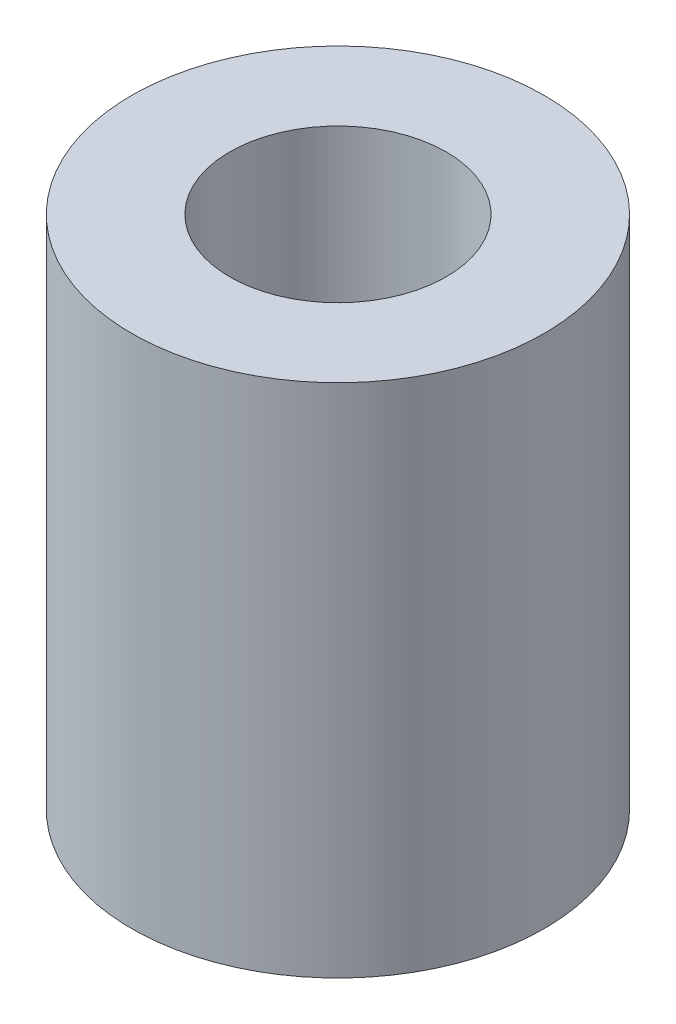
ISO-10303-21;
HEADER;
FILE_DESCRIPTION(('STEP AP214'),'2;1');
FILE_NAME('part.step','',(''),(''),'','','');
FILE_SCHEMA(('AUTOMOTIVE_DESIGN { 1 0 10303 214 1 1 1 1 }'));
ENDSEC;
DATA;
#1=APPLICATION_CONTEXT('core data for automotive mechanical design processes');
#2=APPLICATION_PROTOCOL_DEFINITION('international standard','automotive_design',2000,#1);
#3=PRODUCT_CONTEXT('',#1,'mechanical');
#4=PRODUCT('Part','Part','',(#3));
#5=PRODUCT_RELATED_PRODUCT_CATEGORY('part','',(#4));
#6=PRODUCT_DEFINITION_FORMATION('','',#4);
#7=PRODUCT_DEFINITION_CONTEXT('part definition',#1,'design');
#8=PRODUCT_DEFINITION('design','',#6,#7);
#9=PRODUCT_DEFINITION_SHAPE('','',#8);
#10=(LENGTH_UNIT() NAMED_UNIT(*) SI_UNIT(.MILLI.,.METRE.));
#11=(NAMED_UNIT(*) PLANE_ANGLE_UNIT() SI_UNIT($,.RADIAN.));
#12=(NAMED_UNIT(*) SI_UNIT($,.STERADIAN.) SOLID_ANGLE_UNIT());
#13=UNCERTAINTY_MEASURE_WITH_UNIT(LENGTH_MEASURE(1.E-05),#10,'distance_accuracy_value','');
#14=(GEOMETRIC_REPRESENTATION_CONTEXT(3) GLOBAL_UNCERTAINTY_ASSIGNED_CONTEXT((#13)) GLOBAL_UNIT_ASSIGNED_CONTEXT((#10,
#11,#12)) REPRESENTATION_CONTEXT('',''));
#15=CARTESIAN_POINT('',(0.,0.,0.));
#16=DIRECTION('',(0.,0.,1.));
#17=DIRECTION('',(1.,0.,0.));
#18=AXIS2_PLACEMENT_3D('',#15,#16,#17);
#19=CARTESIAN_POINT('',(-4.,0.,0.));
#20=DIRECTION('',(0.,1.,0.));
#21=DIRECTION('',(0.,0.,1.));
#22=AXIS2_PLACEMENT_3D('',#19,#20,#21);
#23=PLANE('',#22);
#24=CARTESIAN_POINT('',(0.,0.,0.));
#25=DIRECTION('',(0.,-1.,0.));
#26=DIRECTION('',(0.,0.,-1.));
#27=AXIS2_PLACEMENT_3D('',#24,#25,#26);
#28=CIRCLE('',#27,2.1);
#29=CARTESIAN_POINT('',(0.,0.,-2.1));
#30=VERTEX_POINT('',#29);
#31=EDGE_CURVE('E10',#30,#30,#28,.T.);
#32=ORIENTED_EDGE('',*,*,#31,.F.);
#33=EDGE_LOOP('',(#32));
#34=FACE_BOUND('',#33,.T.);
#35=CARTESIAN_POINT('',(0.,0.,0.));
#36=DIRECTION('',(0.,-1.,0.));
#37=DIRECTION('',(0.,0.,-1.));
#38=AXIS2_PLACEMENT_3D('',#35,#36,#37);
#39=CIRCLE('',#38,4.);
#40=CARTESIAN_POINT('',(0.,0.,-4.));
#41=VERTEX_POINT('',#40);
#42=EDGE_CURVE('E56',#41,#41,#39,.T.);
#43=ORIENTED_EDGE('',*,*,#42,.T.);
#44=EDGE_LOOP('',(#43));
#45=FACE_BOUND('',#44,.T.);
#46=ADVANCED_FACE('F39',(#34,#45),#23,.F.);
#47=CARTESIAN_POINT('',(0.,0.,0.));
#48=DIRECTION('',(0.,-1.,0.));
#49=DIRECTION('',(0.,0.,-1.));
#50=AXIS2_PLACEMENT_3D('',#47,#48,#49);
#51=CYLINDRICAL_SURFACE('',#50,2.1);
#52=CARTESIAN_POINT('',(0.,10.,0.));
#53=DIRECTION('',(0.,-1.,0.));
#54=DIRECTION('',(0.,0.,-1.));
#55=AXIS2_PLACEMENT_3D('',#52,#53,#54);
#56=CIRCLE('',#55,2.1);
#57=CARTESIAN_POINT('',(0.,10.,-2.1));
#58=VERTEX_POINT('',#57);
#59=EDGE_CURVE('E46',#58,#58,#56,.T.);
#60=ORIENTED_EDGE('',*,*,#59,.F.);
#61=EDGE_LOOP('',(#60));
#62=FACE_BOUND('',#61,.T.);
#63=ORIENTED_EDGE('',*,*,#31,.T.);
#64=EDGE_LOOP('',(#63));
#65=FACE_BOUND('',#64,.T.);
#66=ADVANCED_FACE('F72',(#62,#65),#51,.F.);
#67=CARTESIAN_POINT('',(-2.1,10.,0.));
#68=DIRECTION('',(0.,-1.,0.));
#69=DIRECTION('',(0.,0.,-1.));
#70=AXIS2_PLACEMENT_3D('',#67,#68,#69);
#71=PLANE('',#70);
#72=CARTESIAN_POINT('',(0.,10.,0.));
#73=DIRECTION('',(0.,-1.,0.));
#74=DIRECTION('',(0.,0.,-1.));
#75=AXIS2_PLACEMENT_3D('',#72,#73,#74);
#76=CIRCLE('',#75,4.);
#77=CARTESIAN_POINT('',(0.,10.,-4.));
#78=VERTEX_POINT('',#77);
#79=EDGE_CURVE('E51',#78,#78,#76,.T.);
#80=ORIENTED_EDGE('',*,*,#79,.F.);
#81=EDGE_LOOP('',(#80));
#82=FACE_BOUND('',#81,.T.);
#83=ORIENTED_EDGE('',*,*,#59,.T.);
#84=EDGE_LOOP('',(#83));
#85=FACE_BOUND('',#84,.T.);
#86=ADVANCED_FACE('F67',(#82,#85),#71,.F.);
#87=CARTESIAN_POINT('',(0.,0.,0.));
#88=DIRECTION('',(0.,-1.,0.));
#89=DIRECTION('',(0.,0.,-1.));
#90=AXIS2_PLACEMENT_3D('',#87,#88,#89);
#91=CYLINDRICAL_SURFACE('',#90,4.);
#92=ORIENTED_EDGE('',*,*,#42,.F.);
#93=EDGE_LOOP('',(#92));
#94=FACE_BOUND('',#93,.T.);
#95=ORIENTED_EDGE('',*,*,#79,.T.);
#96=EDGE_LOOP('',(#95));
#97=FACE_BOUND('',#96,.T.);
#98=ADVANCED_FACE('F64',(#94,#97),#91,.T.);
#99=CLOSED_SHELL('',(#46,#66,#86,#98));
#100=MANIFOLD_SOLID_BREP('B2',#99);
#101=ADVANCED_BREP_SHAPE_REPRESENTATION('',(#18,#100),#14);
#102=SHAPE_DEFINITION_REPRESENTATION(#9,#101);
ENDSEC;
END-ISO-10303-21;
